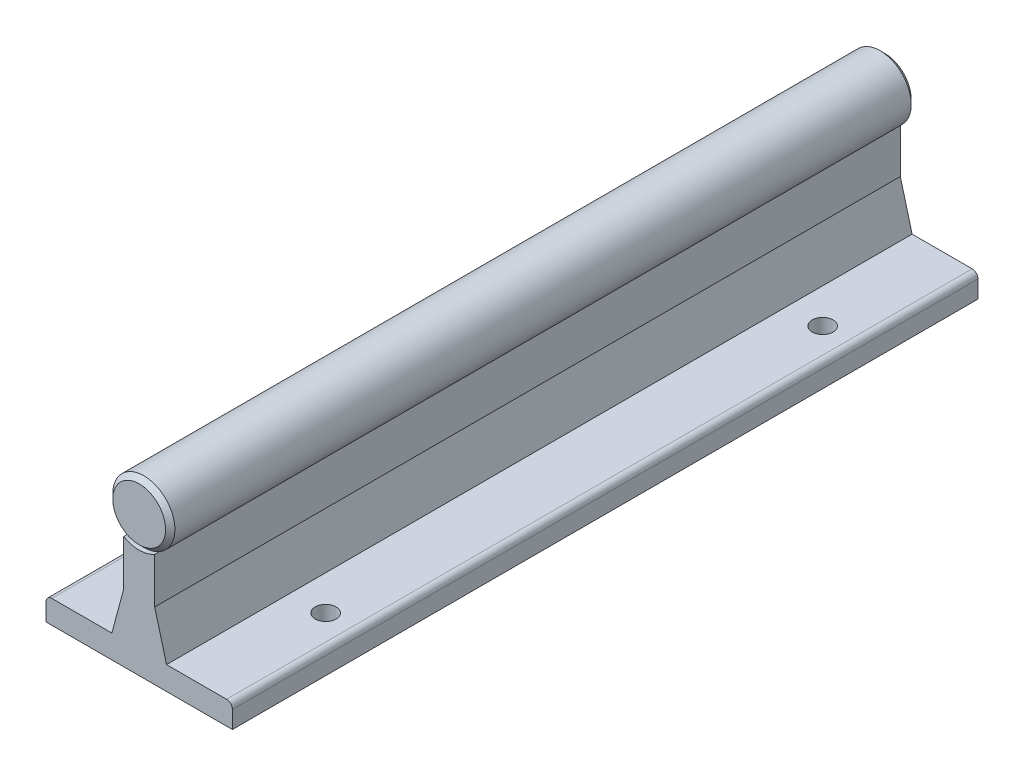
ISO-10303-21;
HEADER;
FILE_DESCRIPTION(('STEP AP214'),'2;1');
FILE_NAME('part.step','',(''),(''),'','','');
FILE_SCHEMA(('AUTOMOTIVE_DESIGN { 1 0 10303 214 1 1 1 1 }'));
ENDSEC;
DATA;
#1=APPLICATION_CONTEXT('core data for automotive mechanical design processes');
#2=APPLICATION_PROTOCOL_DEFINITION('international standard','automotive_design',2000,#1);
#3=PRODUCT_CONTEXT('',#1,'mechanical');
#4=PRODUCT('Part','Part','',(#3));
#5=PRODUCT_RELATED_PRODUCT_CATEGORY('part','',(#4));
#6=PRODUCT_DEFINITION_FORMATION('','',#4);
#7=PRODUCT_DEFINITION_CONTEXT('part definition',#1,'design');
#8=PRODUCT_DEFINITION('design','',#6,#7);
#9=PRODUCT_DEFINITION_SHAPE('','',#8);
#10=(LENGTH_UNIT() NAMED_UNIT(*) SI_UNIT(.MILLI.,.METRE.));
#11=(NAMED_UNIT(*) PLANE_ANGLE_UNIT() SI_UNIT($,.RADIAN.));
#12=(NAMED_UNIT(*) SI_UNIT($,.STERADIAN.) SOLID_ANGLE_UNIT());
#13=UNCERTAINTY_MEASURE_WITH_UNIT(LENGTH_MEASURE(1.E-05),#10,'distance_accuracy_value','');
#14=(GEOMETRIC_REPRESENTATION_CONTEXT(3) GLOBAL_UNCERTAINTY_ASSIGNED_CONTEXT((#13)) GLOBAL_UNIT_ASSIGNED_CONTEXT((#10,
#11,#12)) REPRESENTATION_CONTEXT('',''));
#15=CARTESIAN_POINT('',(0.,0.,0.));
#16=DIRECTION('',(0.,0.,1.));
#17=DIRECTION('',(1.,0.,0.));
#18=AXIS2_PLACEMENT_3D('',#15,#16,#17);
#19=CARTESIAN_POINT('',(-19.05,0.,76.2));
#20=DIRECTION('',(0.,1.,0.));
#21=DIRECTION('',(0.,0.,1.));
#22=AXIS2_PLACEMENT_3D('',#19,#20,#21);
#23=PLANE('',#22);
#24=CARTESIAN_POINT('',(12.7,0.,-50.8));
#25=DIRECTION('',(0.,1.,0.));
#26=DIRECTION('',(0.,0.,1.));
#27=AXIS2_PLACEMENT_3D('',#24,#25,#26);
#28=CIRCLE('',#27,2.1463);
#29=CARTESIAN_POINT('',(12.7,0.,-48.6537));
#30=VERTEX_POINT('',#29);
#31=EDGE_CURVE('E344',#30,#30,#28,.T.);
#32=ORIENTED_EDGE('',*,*,#31,.T.);
#33=EDGE_LOOP('',(#32));
#34=FACE_BOUND('',#33,.T.);
#35=CARTESIAN_POINT('',(12.7,0.,50.8));
#36=DIRECTION('',(0.,1.,0.));
#37=DIRECTION('',(0.,0.,1.));
#38=AXIS2_PLACEMENT_3D('',#35,#36,#37);
#39=CIRCLE('',#38,2.1463);
#40=CARTESIAN_POINT('',(12.7,0.,52.9463));
#41=VERTEX_POINT('',#40);
#42=EDGE_CURVE('E357',#41,#41,#39,.T.);
#43=ORIENTED_EDGE('',*,*,#42,.T.);
#44=EDGE_LOOP('',(#43));
#45=FACE_BOUND('',#44,.T.);
#46=DIRECTION('',(1.,0.,0.));
#47=VECTOR('',#46,1.);
#48=CARTESIAN_POINT('',(-19.05,0.,-76.2));
#49=LINE('',#48,#47);
#50=CARTESIAN_POINT('',(-19.05,0.,-76.2));
#51=VERTEX_POINT('',#50);
#52=CARTESIAN_POINT('',(19.05,0.,-76.2));
#53=VERTEX_POINT('',#52);
#54=EDGE_CURVE('E217',#51,#53,#49,.T.);
#55=ORIENTED_EDGE('',*,*,#54,.T.);
#56=DIRECTION('',(0.,0.,-1.));
#57=VECTOR('',#56,1.);
#58=CARTESIAN_POINT('',(19.05,0.,76.2));
#59=LINE('',#58,#57);
#60=CARTESIAN_POINT('',(19.05,0.,76.2));
#61=VERTEX_POINT('',#60);
#62=EDGE_CURVE('E190',#61,#53,#59,.T.);
#63=ORIENTED_EDGE('',*,*,#62,.F.);
#64=DIRECTION('',(1.,0.,0.));
#65=VECTOR('',#64,1.);
#66=CARTESIAN_POINT('',(-19.05,0.,76.2));
#67=LINE('',#66,#65);
#68=CARTESIAN_POINT('',(-19.05,0.,76.2));
#69=VERTEX_POINT('',#68);
#70=EDGE_CURVE('E372',#69,#61,#67,.T.);
#71=ORIENTED_EDGE('',*,*,#70,.F.);
#72=DIRECTION('',(0.,0.,-1.));
#73=VECTOR('',#72,1.);
#74=CARTESIAN_POINT('',(-19.05,0.,76.2));
#75=LINE('',#74,#73);
#76=EDGE_CURVE('E193',#69,#51,#75,.T.);
#77=ORIENTED_EDGE('',*,*,#76,.T.);
#78=EDGE_LOOP('',(#55,#63,#71,#77));
#79=FACE_BOUND('',#78,.T.);
#80=CARTESIAN_POINT('',(-12.7,0.,50.8));
#81=DIRECTION('',(0.,1.,0.));
#82=DIRECTION('',(0.,0.,1.));
#83=AXIS2_PLACEMENT_3D('',#80,#81,#82);
#84=CIRCLE('',#83,2.1463);
#85=CARTESIAN_POINT('',(-12.7,0.,52.9463));
#86=VERTEX_POINT('',#85);
#87=EDGE_CURVE('E351',#86,#86,#84,.T.);
#88=ORIENTED_EDGE('',*,*,#87,.T.);
#89=EDGE_LOOP('',(#88));
#90=FACE_BOUND('',#89,.T.);
#91=CARTESIAN_POINT('',(-12.7,0.,-50.8));
#92=DIRECTION('',(0.,1.,0.));
#93=DIRECTION('',(0.,0.,1.));
#94=AXIS2_PLACEMENT_3D('',#91,#92,#93);
#95=CIRCLE('',#94,2.1463);
#96=CARTESIAN_POINT('',(-12.7,0.,-48.6537));
#97=VERTEX_POINT('',#96);
#98=EDGE_CURVE('E341',#97,#97,#95,.T.);
#99=ORIENTED_EDGE('',*,*,#98,.T.);
#100=EDGE_LOOP('',(#99));
#101=FACE_BOUND('',#100,.T.);
#102=ADVANCED_FACE('F32',(#34,#45,#79,#90,#101),#23,.F.);
#103=CARTESIAN_POINT('',(-5.58598361192192,4.7625,76.2));
#104=DIRECTION('',(0.,-1.,0.));
#105=DIRECTION('',(1.,0.,0.));
#106=AXIS2_PLACEMENT_3D('',#103,#104,#105);
#107=PLANE('',#106);
#108=CARTESIAN_POINT('',(-12.7,4.7625,50.8));
#109=DIRECTION('',(0.,-1.,0.));
#110=DIRECTION('',(1.,0.,0.));
#111=AXIS2_PLACEMENT_3D('',#108,#109,#110);
#112=CIRCLE('',#111,2.1463);
#113=CARTESIAN_POINT('',(-10.5537,4.7625,50.8));
#114=VERTEX_POINT('',#113);
#115=EDGE_CURVE('E354',#114,#114,#112,.T.);
#116=ORIENTED_EDGE('',*,*,#115,.T.);
#117=EDGE_LOOP('',(#116));
#118=FACE_BOUND('',#117,.T.);
#119=DIRECTION('',(-1.,0.,0.));
#120=VECTOR('',#119,1.);
#121=CARTESIAN_POINT('',(-5.58598361192192,4.7625,-76.2));
#122=LINE('',#121,#120);
#123=CARTESIAN_POINT('',(-5.58598361192192,4.7625,-76.2));
#124=VERTEX_POINT('',#123);
#125=CARTESIAN_POINT('',(-17.859375,4.7625,-76.2));
#126=VERTEX_POINT('',#125);
#127=EDGE_CURVE('E165',#124,#126,#122,.T.);
#128=ORIENTED_EDGE('',*,*,#127,.T.);
#129=DIRECTION('',(0.,0.,-1.));
#130=VECTOR('',#129,1.);
#131=CARTESIAN_POINT('',(-17.859375,4.7625,76.2));
#132=LINE('',#131,#130);
#133=CARTESIAN_POINT('',(-17.859375,4.7625,76.2));
#134=VERTEX_POINT('',#133);
#135=EDGE_CURVE('E11',#126,#134,#132,.F.);
#136=ORIENTED_EDGE('',*,*,#135,.T.);
#137=DIRECTION('',(-1.,0.,0.));
#138=VECTOR('',#137,1.);
#139=CARTESIAN_POINT('',(-5.58598361192192,4.7625,76.2));
#140=LINE('',#139,#138);
#141=CARTESIAN_POINT('',(-5.58598361192192,4.7625,76.2));
#142=VERTEX_POINT('',#141);
#143=EDGE_CURVE('E177',#142,#134,#140,.T.);
#144=ORIENTED_EDGE('',*,*,#143,.F.);
#145=DIRECTION('',(0.,0.,-1.));
#146=VECTOR('',#145,1.);
#147=CARTESIAN_POINT('',(-5.58598361192192,4.7625,76.2));
#148=LINE('',#147,#146);
#149=EDGE_CURVE('E173',#142,#124,#148,.T.);
#150=ORIENTED_EDGE('',*,*,#149,.T.);
#151=EDGE_LOOP('',(#128,#136,#144,#150));
#152=FACE_BOUND('',#151,.T.);
#153=CARTESIAN_POINT('',(-12.7,4.7625,-50.8));
#154=DIRECTION('',(0.,-1.,0.));
#155=DIRECTION('',(1.,0.,0.));
#156=AXIS2_PLACEMENT_3D('',#153,#154,#155);
#157=CIRCLE('',#156,2.1463);
#158=CARTESIAN_POINT('',(-10.5537,4.7625,-50.8));
#159=VERTEX_POINT('',#158);
#160=EDGE_CURVE('E338',#159,#159,#157,.T.);
#161=ORIENTED_EDGE('',*,*,#160,.T.);
#162=EDGE_LOOP('',(#161));
#163=FACE_BOUND('',#162,.T.);
#164=ADVANCED_FACE('F270',(#118,#152,#163),#107,.F.);
#165=CARTESIAN_POINT('',(19.05,4.7625,76.2));
#166=DIRECTION('',(0.,-1.,0.));
#167=DIRECTION('',(1.,0.,0.));
#168=AXIS2_PLACEMENT_3D('',#165,#166,#167);
#169=PLANE('',#168);
#170=CARTESIAN_POINT('',(12.7,4.7625,50.8));
#171=DIRECTION('',(0.,-1.,0.));
#172=DIRECTION('',(1.,0.,0.));
#173=AXIS2_PLACEMENT_3D('',#170,#171,#172);
#174=CIRCLE('',#173,2.1463);
#175=CARTESIAN_POINT('',(14.8463,4.7625,50.8));
#176=VERTEX_POINT('',#175);
#177=EDGE_CURVE('E145',#176,#176,#174,.T.);
#178=ORIENTED_EDGE('',*,*,#177,.T.);
#179=EDGE_LOOP('',(#178));
#180=FACE_BOUND('',#179,.T.);
#181=DIRECTION('',(-1.,0.,0.));
#182=VECTOR('',#181,1.);
#183=CARTESIAN_POINT('',(19.05,4.7625,76.2));
#184=LINE('',#183,#182);
#185=CARTESIAN_POINT('',(17.859375,4.7625,76.2));
#186=VERTEX_POINT('',#185);
#187=CARTESIAN_POINT('',(5.58598361192192,4.7625,76.2));
#188=VERTEX_POINT('',#187);
#189=EDGE_CURVE('E250',#186,#188,#184,.T.);
#190=ORIENTED_EDGE('',*,*,#189,.F.);
#191=DIRECTION('',(0.,0.,-1.));
#192=VECTOR('',#191,1.);
#193=CARTESIAN_POINT('',(17.859375,4.7625,76.2));
#194=LINE('',#193,#192);
#195=CARTESIAN_POINT('',(17.859375,4.7625,-76.2));
#196=VERTEX_POINT('',#195);
#197=EDGE_CURVE('E196',#186,#196,#194,.T.);
#198=ORIENTED_EDGE('',*,*,#197,.T.);
#199=DIRECTION('',(-1.,0.,0.));
#200=VECTOR('',#199,1.);
#201=CARTESIAN_POINT('',(19.05,4.7625,-76.2));
#202=LINE('',#201,#200);
#203=CARTESIAN_POINT('',(5.58598361192192,4.7625,-76.2));
#204=VERTEX_POINT('',#203);
#205=EDGE_CURVE('E230',#196,#204,#202,.T.);
#206=ORIENTED_EDGE('',*,*,#205,.T.);
#207=DIRECTION('',(0.,0.,-1.));
#208=VECTOR('',#207,1.);
#209=CARTESIAN_POINT('',(5.58598361192192,4.7625,76.2));
#210=LINE('',#209,#208);
#211=EDGE_CURVE('E187',#188,#204,#210,.T.);
#212=ORIENTED_EDGE('',*,*,#211,.F.);
#213=EDGE_LOOP('',(#190,#198,#206,#212));
#214=FACE_BOUND('',#213,.T.);
#215=CARTESIAN_POINT('',(12.7,4.7625,-50.8));
#216=DIRECTION('',(0.,-1.,0.));
#217=DIRECTION('',(1.,0.,0.));
#218=AXIS2_PLACEMENT_3D('',#215,#216,#217);
#219=CIRCLE('',#218,2.1463);
#220=CARTESIAN_POINT('',(14.8463,4.7625,-50.8));
#221=VERTEX_POINT('',#220);
#222=EDGE_CURVE('E348',#221,#221,#219,.T.);
#223=ORIENTED_EDGE('',*,*,#222,.T.);
#224=EDGE_LOOP('',(#223));
#225=FACE_BOUND('',#224,.T.);
#226=ADVANCED_FACE('F276',(#180,#214,#225),#169,.F.);
#227=CARTESIAN_POINT('',(0.,28.575,76.2));
#228=DIRECTION('',(0.,0.,-1.));
#229=DIRECTION('',(-1.,0.,0.));
#230=AXIS2_PLACEMENT_3D('',#227,#228,#229);
#231=CYLINDRICAL_SURFACE('',#230,6.35);
#232=CARTESIAN_POINT('',(0.,28.575,-75.2475));
#233=DIRECTION('',(0.,0.,1.));
#234=DIRECTION('',(1.,0.,0.));
#235=AXIS2_PLACEMENT_3D('',#232,#233,#234);
#236=CIRCLE('',#235,6.35);
#237=CARTESIAN_POINT('',(3.175,23.0757386859688,-75.2475));
#238=VERTEX_POINT('',#237);
#239=CARTESIAN_POINT('',(-3.175,23.0757386859688,-75.2475));
#240=VERTEX_POINT('',#239);
#241=EDGE_CURVE('E144',#238,#240,#236,.T.);
#242=ORIENTED_EDGE('',*,*,#241,.T.);
#243=DIRECTION('',(0.,0.,-1.));
#244=VECTOR('',#243,1.);
#245=CARTESIAN_POINT('',(-3.17500000000001,23.0757386859688,76.2));
#246=LINE('',#245,#244);
#247=CARTESIAN_POINT('',(-3.175,23.0757386859688,75.2475));
#248=VERTEX_POINT('',#247);
#249=EDGE_CURVE('E155',#248,#240,#246,.T.);
#250=ORIENTED_EDGE('',*,*,#249,.F.);
#251=CARTESIAN_POINT('',(0.,28.575,75.2475));
#252=DIRECTION('',(0.,0.,1.));
#253=DIRECTION('',(1.,0.,0.));
#254=AXIS2_PLACEMENT_3D('',#251,#252,#253);
#255=CIRCLE('',#254,6.35);
#256=CARTESIAN_POINT('',(3.175,23.0757386859688,75.2475));
#257=VERTEX_POINT('',#256);
#258=EDGE_CURVE('E369',#257,#248,#255,.T.);
#259=ORIENTED_EDGE('',*,*,#258,.F.);
#260=DIRECTION('',(0.,0.,-1.));
#261=VECTOR('',#260,1.);
#262=CARTESIAN_POINT('',(3.175,23.0757386859688,76.2));
#263=LINE('',#262,#261);
#264=EDGE_CURVE('E181',#257,#238,#263,.T.);
#265=ORIENTED_EDGE('',*,*,#264,.T.);
#266=EDGE_LOOP('',(#242,#250,#259,#265));
#267=FACE_BOUND('',#266,.T.);
#268=ADVANCED_FACE('F296',(#267),#231,.T.);
#269=CARTESIAN_POINT('',(0.,28.575,-76.2));
#270=DIRECTION('',(0.,0.,1.));
#271=DIRECTION('',(1.,0.,0.));
#272=AXIS2_PLACEMENT_3D('',#269,#270,#271);
#273=PLANE('',#272);
#274=ORIENTED_EDGE('',*,*,#205,.F.);
#275=CARTESIAN_POINT('',(17.859375,3.571875,-76.2));
#276=DIRECTION('',(0.,0.,1.));
#277=DIRECTION('',(1.,0.,0.));
#278=AXIS2_PLACEMENT_3D('',#275,#276,#277);
#279=CIRCLE('',#278,1.190625);
#280=CARTESIAN_POINT('',(19.05,3.571875,-76.2));
#281=VERTEX_POINT('',#280);
#282=EDGE_CURVE('E201',#196,#281,#279,.F.);
#283=ORIENTED_EDGE('',*,*,#282,.T.);
#284=DIRECTION('',(0.,1.,0.));
#285=VECTOR('',#284,1.);
#286=CARTESIAN_POINT('',(19.05,0.,-76.2));
#287=LINE('',#286,#285);
#288=EDGE_CURVE('E220',#53,#281,#287,.T.);
#289=ORIENTED_EDGE('',*,*,#288,.F.);
#290=ORIENTED_EDGE('',*,*,#54,.F.);
#291=DIRECTION('',(0.,-1.,0.));
#292=VECTOR('',#291,1.);
#293=CARTESIAN_POINT('',(-19.05,4.7625,-76.2));
#294=LINE('',#293,#292);
#295=CARTESIAN_POINT('',(-19.05,3.571875,-76.2));
#296=VERTEX_POINT('',#295);
#297=EDGE_CURVE('E213',#296,#51,#294,.T.);
#298=ORIENTED_EDGE('',*,*,#297,.F.);
#299=CARTESIAN_POINT('',(-17.859375,3.571875,-76.2));
#300=DIRECTION('',(0.,0.,1.));
#301=DIRECTION('',(1.,0.,0.));
#302=AXIS2_PLACEMENT_3D('',#299,#300,#301);
#303=CIRCLE('',#302,1.190625);
#304=EDGE_CURVE('E199',#296,#126,#303,.F.);
#305=ORIENTED_EDGE('',*,*,#304,.T.);
#306=ORIENTED_EDGE('',*,*,#127,.F.);
#307=DIRECTION('',(-0.258819045102521,-0.965925826289068,0.));
#308=VECTOR('',#307,1.);
#309=CARTESIAN_POINT('',(-3.175,13.7604133359085,-76.2));
#310=LINE('',#309,#308);
#311=CARTESIAN_POINT('',(-3.175,13.7604133359085,-76.2));
#312=VERTEX_POINT('',#311);
#313=EDGE_CURVE('E162',#312,#124,#310,.T.);
#314=ORIENTED_EDGE('',*,*,#313,.F.);
#315=DIRECTION('',(0.,-1.,0.));
#316=VECTOR('',#315,1.);
#317=CARTESIAN_POINT('',(-3.175,23.0757386859688,-76.2));
#318=LINE('',#317,#316);
#319=CARTESIAN_POINT('',(-3.175,23.0757386859688,-76.2));
#320=VERTEX_POINT('',#319);
#321=EDGE_CURVE('E151',#320,#312,#318,.T.);
#322=ORIENTED_EDGE('',*,*,#321,.F.);
#323=CARTESIAN_POINT('',(0.,28.575,-76.2));
#324=DIRECTION('',(0.,0.,1.));
#325=DIRECTION('',(1.,0.,0.));
#326=AXIS2_PLACEMENT_3D('',#323,#324,#325);
#327=CIRCLE('',#326,6.35);
#328=CARTESIAN_POINT('',(3.175,23.0757386859688,-76.2));
#329=VERTEX_POINT('',#328);
#330=EDGE_CURVE('E132',#320,#329,#327,.T.);
#331=ORIENTED_EDGE('',*,*,#330,.T.);
#332=DIRECTION('',(0.,1.,0.));
#333=VECTOR('',#332,1.);
#334=CARTESIAN_POINT('',(3.175,23.0757386859688,-76.2));
#335=LINE('',#334,#333);
#336=CARTESIAN_POINT('',(3.175,13.7604133359085,-76.2));
#337=VERTEX_POINT('',#336);
#338=EDGE_CURVE('E163',#337,#329,#335,.T.);
#339=ORIENTED_EDGE('',*,*,#338,.F.);
#340=DIRECTION('',(-0.258819045102521,0.965925826289068,0.));
#341=VECTOR('',#340,1.);
#342=CARTESIAN_POINT('',(3.175,13.7604133359085,-76.2));
#343=LINE('',#342,#341);
#344=EDGE_CURVE('E167',#204,#337,#343,.T.);
#345=ORIENTED_EDGE('',*,*,#344,.F.);
#346=EDGE_LOOP('',(#274,#283,#289,#290,#298,#305,#306,#314,#322,#331,#339,#345));
#347=FACE_BOUND('',#346,.T.);
#348=ADVANCED_FACE('F160',(#347),#273,.F.);
#349=CARTESIAN_POINT('',(0.,28.575,76.2));
#350=DIRECTION('',(0.,0.,1.));
#351=DIRECTION('',(1.,0.,0.));
#352=AXIS2_PLACEMENT_3D('',#349,#350,#351);
#353=PLANE('',#352);
#354=DIRECTION('',(0.,1.,0.));
#355=VECTOR('',#354,1.);
#356=CARTESIAN_POINT('',(19.05,0.,76.2));
#357=LINE('',#356,#355);
#358=CARTESIAN_POINT('',(19.05,3.571875,76.2));
#359=VERTEX_POINT('',#358);
#360=EDGE_CURVE('E374',#61,#359,#357,.T.);
#361=ORIENTED_EDGE('',*,*,#360,.T.);
#362=CARTESIAN_POINT('',(17.859375,3.571875,76.2));
#363=DIRECTION('',(0.,0.,1.));
#364=DIRECTION('',(1.,0.,0.));
#365=AXIS2_PLACEMENT_3D('',#362,#363,#364);
#366=CIRCLE('',#365,1.190625);
#367=EDGE_CURVE('E206',#359,#186,#366,.T.);
#368=ORIENTED_EDGE('',*,*,#367,.T.);
#369=ORIENTED_EDGE('',*,*,#189,.T.);
#370=DIRECTION('',(-0.258819045102521,0.965925826289068,0.));
#371=VECTOR('',#370,1.);
#372=CARTESIAN_POINT('',(3.175,13.7604133359085,76.2));
#373=LINE('',#372,#371);
#374=CARTESIAN_POINT('',(3.175,13.7604133359085,76.2));
#375=VERTEX_POINT('',#374);
#376=EDGE_CURVE('E246',#188,#375,#373,.T.);
#377=ORIENTED_EDGE('',*,*,#376,.T.);
#378=DIRECTION('',(0.,1.,0.));
#379=VECTOR('',#378,1.);
#380=CARTESIAN_POINT('',(3.175,23.0757386859688,76.2));
#381=LINE('',#380,#379);
#382=CARTESIAN_POINT('',(3.175,23.0757386859688,76.2));
#383=VERTEX_POINT('',#382);
#384=EDGE_CURVE('E242',#375,#383,#381,.T.);
#385=ORIENTED_EDGE('',*,*,#384,.T.);
#386=CARTESIAN_POINT('',(0.,28.575,76.2));
#387=DIRECTION('',(0.,0.,1.));
#388=DIRECTION('',(1.,0.,0.));
#389=AXIS2_PLACEMENT_3D('',#386,#387,#388);
#390=CIRCLE('',#389,6.35);
#391=CARTESIAN_POINT('',(-3.17500000000001,23.0757386859688,76.2));
#392=VERTEX_POINT('',#391);
#393=EDGE_CURVE('E367',#392,#383,#390,.T.);
#394=ORIENTED_EDGE('',*,*,#393,.F.);
#395=DIRECTION('',(0.,-1.,0.));
#396=VECTOR('',#395,1.);
#397=CARTESIAN_POINT('',(-3.175,23.0757386859688,76.2));
#398=LINE('',#397,#396);
#399=CARTESIAN_POINT('',(-3.175,13.7604133359085,76.2));
#400=VERTEX_POINT('',#399);
#401=EDGE_CURVE('E245',#392,#400,#398,.T.);
#402=ORIENTED_EDGE('',*,*,#401,.T.);
#403=DIRECTION('',(-0.258819045102521,-0.965925826289068,0.));
#404=VECTOR('',#403,1.);
#405=CARTESIAN_POINT('',(-3.175,13.7604133359085,76.2));
#406=LINE('',#405,#404);
#407=EDGE_CURVE('E248',#400,#142,#406,.T.);
#408=ORIENTED_EDGE('',*,*,#407,.T.);
#409=ORIENTED_EDGE('',*,*,#143,.T.);
#410=CARTESIAN_POINT('',(-17.859375,3.571875,76.2));
#411=DIRECTION('',(0.,0.,1.));
#412=DIRECTION('',(1.,0.,0.));
#413=AXIS2_PLACEMENT_3D('',#410,#411,#412);
#414=CIRCLE('',#413,1.190625);
#415=CARTESIAN_POINT('',(-19.05,3.571875,76.2));
#416=VERTEX_POINT('',#415);
#417=EDGE_CURVE('E47',#134,#416,#414,.T.);
#418=ORIENTED_EDGE('',*,*,#417,.T.);
#419=DIRECTION('',(0.,-1.,0.));
#420=VECTOR('',#419,1.);
#421=CARTESIAN_POINT('',(-19.05,4.7625,76.2));
#422=LINE('',#421,#420);
#423=EDGE_CURVE('E172',#416,#69,#422,.T.);
#424=ORIENTED_EDGE('',*,*,#423,.T.);
#425=ORIENTED_EDGE('',*,*,#70,.T.);
#426=EDGE_LOOP('',(#361,#368,#369,#377,#385,#394,#402,#408,#409,#418,#424,#425));
#427=FACE_BOUND('',#426,.T.);
#428=ADVANCED_FACE('F256',(#427),#353,.T.);
#429=CARTESIAN_POINT('',(-19.05,4.7625,76.2));
#430=DIRECTION('',(1.,0.,0.));
#431=DIRECTION('',(0.,1.,0.));
#432=AXIS2_PLACEMENT_3D('',#429,#430,#431);
#433=PLANE('',#432);
#434=ORIENTED_EDGE('',*,*,#423,.F.);
#435=DIRECTION('',(0.,0.,-1.));
#436=VECTOR('',#435,1.);
#437=CARTESIAN_POINT('',(-19.05,3.571875,76.2));
#438=LINE('',#437,#436);
#439=EDGE_CURVE('E40',#416,#296,#438,.T.);
#440=ORIENTED_EDGE('',*,*,#439,.T.);
#441=ORIENTED_EDGE('',*,*,#297,.T.);
#442=ORIENTED_EDGE('',*,*,#76,.F.);
#443=EDGE_LOOP('',(#434,#440,#441,#442));
#444=FACE_BOUND('',#443,.T.);
#445=ADVANCED_FACE('F211',(#444),#433,.F.);
#446=CARTESIAN_POINT('',(19.05,0.,76.2));
#447=DIRECTION('',(-1.,0.,0.));
#448=DIRECTION('',(0.,-1.,0.));
#449=AXIS2_PLACEMENT_3D('',#446,#447,#448);
#450=PLANE('',#449);
#451=ORIENTED_EDGE('',*,*,#288,.T.);
#452=DIRECTION('',(0.,0.,-1.));
#453=VECTOR('',#452,1.);
#454=CARTESIAN_POINT('',(19.05,3.571875,76.2));
#455=LINE('',#454,#453);
#456=EDGE_CURVE('E203',#281,#359,#455,.F.);
#457=ORIENTED_EDGE('',*,*,#456,.T.);
#458=ORIENTED_EDGE('',*,*,#360,.F.);
#459=ORIENTED_EDGE('',*,*,#62,.T.);
#460=EDGE_LOOP('',(#451,#457,#458,#459));
#461=FACE_BOUND('',#460,.T.);
#462=ADVANCED_FACE('F283',(#461),#450,.F.);
#463=CARTESIAN_POINT('',(3.175,13.7604133359085,76.2));
#464=DIRECTION('',(-0.965925826289068,-0.258819045102521,0.));
#465=DIRECTION('',(0.258819045102521,-0.965925826289068,0.));
#466=AXIS2_PLACEMENT_3D('',#463,#464,#465);
#467=PLANE('',#466);
#468=ORIENTED_EDGE('',*,*,#344,.T.);
#469=DIRECTION('',(0.,0.,-1.));
#470=VECTOR('',#469,1.);
#471=CARTESIAN_POINT('',(3.175,13.7604133359085,76.2));
#472=LINE('',#471,#470);
#473=EDGE_CURVE('E184',#375,#337,#472,.T.);
#474=ORIENTED_EDGE('',*,*,#473,.F.);
#475=ORIENTED_EDGE('',*,*,#376,.F.);
#476=ORIENTED_EDGE('',*,*,#211,.T.);
#477=EDGE_LOOP('',(#468,#474,#475,#476));
#478=FACE_BOUND('',#477,.T.);
#479=ADVANCED_FACE('F234',(#478),#467,.F.);
#480=CARTESIAN_POINT('',(3.175,23.0757386859688,76.2));
#481=DIRECTION('',(-1.,0.,0.));
#482=DIRECTION('',(0.,0.,1.));
#483=AXIS2_PLACEMENT_3D('',#480,#481,#482);
#484=PLANE('',#483);
#485=ORIENTED_EDGE('',*,*,#338,.T.);
#486=DIRECTION('',(0.,0.,-1.));
#487=VECTOR('',#486,1.);
#488=CARTESIAN_POINT('',(3.175,23.0757386859688,-75.2475));
#489=LINE('',#488,#487);
#490=EDGE_CURVE('E139',#238,#329,#489,.T.);
#491=ORIENTED_EDGE('',*,*,#490,.F.);
#492=ORIENTED_EDGE('',*,*,#264,.F.);
#493=EDGE_CURVE('E182',#383,#257,#263,.T.);
#494=ORIENTED_EDGE('',*,*,#493,.F.);
#495=ORIENTED_EDGE('',*,*,#384,.F.);
#496=ORIENTED_EDGE('',*,*,#473,.T.);
#497=EDGE_LOOP('',(#485,#491,#492,#494,#495,#496));
#498=FACE_BOUND('',#497,.T.);
#499=ADVANCED_FACE('F239',(#498),#484,.F.);
#500=CARTESIAN_POINT('',(-3.175,23.0757386859688,76.2));
#501=DIRECTION('',(1.,0.,0.));
#502=DIRECTION('',(0.,0.,-1.));
#503=AXIS2_PLACEMENT_3D('',#500,#501,#502);
#504=PLANE('',#503);
#505=ORIENTED_EDGE('',*,*,#321,.T.);
#506=DIRECTION('',(0.,0.,-1.));
#507=VECTOR('',#506,1.);
#508=CARTESIAN_POINT('',(-3.175,13.7604133359085,76.2));
#509=LINE('',#508,#507);
#510=EDGE_CURVE('E176',#400,#312,#509,.T.);
#511=ORIENTED_EDGE('',*,*,#510,.F.);
#512=ORIENTED_EDGE('',*,*,#401,.F.);
#513=EDGE_CURVE('E179',#392,#248,#246,.T.);
#514=ORIENTED_EDGE('',*,*,#513,.T.);
#515=ORIENTED_EDGE('',*,*,#249,.T.);
#516=DIRECTION('',(0.,0.,-1.));
#517=VECTOR('',#516,1.);
#518=CARTESIAN_POINT('',(-3.175,23.0757386859688,-75.2475));
#519=LINE('',#518,#517);
#520=EDGE_CURVE('E136',#320,#240,#519,.F.);
#521=ORIENTED_EDGE('',*,*,#520,.F.);
#522=EDGE_LOOP('',(#505,#511,#512,#514,#515,#521));
#523=FACE_BOUND('',#522,.T.);
#524=ADVANCED_FACE('F149',(#523),#504,.F.);
#525=CARTESIAN_POINT('',(-3.175,13.7604133359085,76.2));
#526=DIRECTION('',(0.965925826289068,-0.258819045102521,0.));
#527=DIRECTION('',(0.258819045102521,0.965925826289068,0.));
#528=AXIS2_PLACEMENT_3D('',#525,#526,#527);
#529=PLANE('',#528);
#530=ORIENTED_EDGE('',*,*,#313,.T.);
#531=ORIENTED_EDGE('',*,*,#149,.F.);
#532=ORIENTED_EDGE('',*,*,#407,.F.);
#533=ORIENTED_EDGE('',*,*,#510,.T.);
#534=EDGE_LOOP('',(#530,#531,#532,#533));
#535=FACE_BOUND('',#534,.T.);
#536=ADVANCED_FACE('F315',(#535),#529,.F.);
#537=CARTESIAN_POINT('',(0.,28.575,76.2));
#538=DIRECTION('',(0.,0.,1.));
#539=DIRECTION('',(1.,0.,0.));
#540=AXIS2_PLACEMENT_3D('',#537,#538,#539);
#541=CYLINDRICAL_SURFACE('',#540,6.35);
#542=ORIENTED_EDGE('',*,*,#493,.T.);
#543=EDGE_CURVE('E223',#248,#257,#255,.T.);
#544=ORIENTED_EDGE('',*,*,#543,.F.);
#545=ORIENTED_EDGE('',*,*,#513,.F.);
#546=ORIENTED_EDGE('',*,*,#393,.T.);
#547=EDGE_LOOP('',(#542,#544,#545,#546));
#548=FACE_BOUND('',#547,.T.);
#549=ADVANCED_FACE('F308',(#548),#541,.F.);
#550=CARTESIAN_POINT('',(0.,28.575,76.2));
#551=DIRECTION('',(0.,0.,-1.));
#552=DIRECTION('',(-1.,0.,0.));
#553=AXIS2_PLACEMENT_3D('',#550,#551,#552);
#554=CONICAL_SURFACE('',#553,5.39749999999999,0.785398163397448);
#555=ORIENTED_EDGE('',*,*,#543,.T.);
#556=ORIENTED_EDGE('',*,*,#258,.T.);
#557=EDGE_LOOP('',(#555,#556));
#558=FACE_BOUND('',#557,.T.);
#559=CARTESIAN_POINT('',(0.,28.575,76.2));
#560=DIRECTION('',(0.,0.,1.));
#561=DIRECTION('',(1.,0.,0.));
#562=AXIS2_PLACEMENT_3D('',#559,#560,#561);
#563=CIRCLE('',#562,5.39749999999999);
#564=CARTESIAN_POINT('',(5.39749999999999,28.575,76.2));
#565=VERTEX_POINT('',#564);
#566=EDGE_CURVE('E218',#565,#565,#563,.T.);
#567=ORIENTED_EDGE('',*,*,#566,.F.);
#568=EDGE_LOOP('',(#567));
#569=FACE_BOUND('',#568,.T.);
#570=ADVANCED_FACE('F300',(#558,#569),#554,.T.);
#571=ORIENTED_EDGE('',*,*,#566,.T.);
#572=EDGE_LOOP('',(#571));
#573=FACE_BOUND('',#572,.T.);
#574=ADVANCED_FACE('F292',(#573),#353,.T.);
#575=CARTESIAN_POINT('',(0.,28.575,-75.2475));
#576=DIRECTION('',(0.,0.,-1.));
#577=DIRECTION('',(1.,0.,0.));
#578=AXIS2_PLACEMENT_3D('',#575,#576,#577);
#579=CYLINDRICAL_SURFACE('',#578,6.35);
#580=ORIENTED_EDGE('',*,*,#490,.T.);
#581=ORIENTED_EDGE('',*,*,#330,.F.);
#582=ORIENTED_EDGE('',*,*,#520,.T.);
#583=EDGE_CURVE('E362',#240,#238,#236,.T.);
#584=ORIENTED_EDGE('',*,*,#583,.T.);
#585=EDGE_LOOP('',(#580,#581,#582,#584));
#586=FACE_BOUND('',#585,.T.);
#587=ADVANCED_FACE('F134',(#586),#579,.F.);
#588=CARTESIAN_POINT('',(0.,28.575,-76.2));
#589=DIRECTION('',(0.,0.,1.));
#590=DIRECTION('',(-1.,0.,0.));
#591=AXIS2_PLACEMENT_3D('',#588,#589,#590);
#592=CONICAL_SURFACE('',#591,5.39749999999999,0.785398163397448);
#593=ORIENTED_EDGE('',*,*,#583,.F.);
#594=ORIENTED_EDGE('',*,*,#241,.F.);
#595=EDGE_LOOP('',(#593,#594));
#596=FACE_BOUND('',#595,.T.);
#597=CARTESIAN_POINT('',(0.,28.575,-76.2));
#598=DIRECTION('',(0.,0.,1.));
#599=DIRECTION('',(1.,0.,0.));
#600=AXIS2_PLACEMENT_3D('',#597,#598,#599);
#601=CIRCLE('',#600,5.39749999999999);
#602=CARTESIAN_POINT('',(5.39749999999999,28.575,-76.2));
#603=VERTEX_POINT('',#602);
#604=EDGE_CURVE('E156',#603,#603,#601,.T.);
#605=ORIENTED_EDGE('',*,*,#604,.T.);
#606=EDGE_LOOP('',(#605));
#607=FACE_BOUND('',#606,.T.);
#608=ADVANCED_FACE('F306',(#596,#607),#592,.T.);
#609=ORIENTED_EDGE('',*,*,#604,.F.);
#610=EDGE_LOOP('',(#609));
#611=FACE_BOUND('',#610,.T.);
#612=ADVANCED_FACE('F267',(#611),#273,.F.);
#613=CARTESIAN_POINT('',(17.859375,3.571875,76.2));
#614=DIRECTION('',(0.,0.,-1.));
#615=DIRECTION('',(-1.,0.,0.));
#616=AXIS2_PLACEMENT_3D('',#613,#614,#615);
#617=CYLINDRICAL_SURFACE('',#616,1.190625);
#618=ORIENTED_EDGE('',*,*,#367,.F.);
#619=ORIENTED_EDGE('',*,*,#456,.F.);
#620=ORIENTED_EDGE('',*,*,#282,.F.);
#621=ORIENTED_EDGE('',*,*,#197,.F.);
#622=EDGE_LOOP('',(#618,#619,#620,#621));
#623=FACE_BOUND('',#622,.T.);
#624=ADVANCED_FACE('F259',(#623),#617,.T.);
#625=CARTESIAN_POINT('',(-17.859375,3.571875,76.2));
#626=DIRECTION('',(0.,0.,-1.));
#627=DIRECTION('',(-1.,0.,0.));
#628=AXIS2_PLACEMENT_3D('',#625,#626,#627);
#629=CYLINDRICAL_SURFACE('',#628,1.190625);
#630=ORIENTED_EDGE('',*,*,#417,.F.);
#631=ORIENTED_EDGE('',*,*,#135,.F.);
#632=ORIENTED_EDGE('',*,*,#304,.F.);
#633=ORIENTED_EDGE('',*,*,#439,.F.);
#634=EDGE_LOOP('',(#630,#631,#632,#633));
#635=FACE_BOUND('',#634,.T.);
#636=ADVANCED_FACE('F34',(#635),#629,.T.);
#637=CARTESIAN_POINT('',(12.7,10.8331531378427,50.8));
#638=DIRECTION('',(0.,-1.,0.));
#639=DIRECTION('',(0.,0.,-1.));
#640=AXIS2_PLACEMENT_3D('',#637,#638,#639);
#641=CYLINDRICAL_SURFACE('',#640,2.1463);
#642=ORIENTED_EDGE('',*,*,#177,.F.);
#643=EDGE_LOOP('',(#642));
#644=FACE_BOUND('',#643,.T.);
#645=ORIENTED_EDGE('',*,*,#42,.F.);
#646=EDGE_LOOP('',(#645));
#647=FACE_BOUND('',#646,.T.);
#648=ADVANCED_FACE('F258',(#644,#647),#641,.F.);
#649=CARTESIAN_POINT('',(-12.7,10.8331531378427,50.8));
#650=DIRECTION('',(0.,-1.,0.));
#651=DIRECTION('',(0.,0.,-1.));
#652=AXIS2_PLACEMENT_3D('',#649,#650,#651);
#653=CYLINDRICAL_SURFACE('',#652,2.1463);
#654=ORIENTED_EDGE('',*,*,#115,.F.);
#655=EDGE_LOOP('',(#654));
#656=FACE_BOUND('',#655,.T.);
#657=ORIENTED_EDGE('',*,*,#87,.F.);
#658=EDGE_LOOP('',(#657));
#659=FACE_BOUND('',#658,.T.);
#660=ADVANCED_FACE('F264',(#656,#659),#653,.F.);
#661=CARTESIAN_POINT('',(12.7,10.8331531378427,-50.8));
#662=DIRECTION('',(0.,-1.,0.));
#663=DIRECTION('',(0.,0.,-1.));
#664=AXIS2_PLACEMENT_3D('',#661,#662,#663);
#665=CYLINDRICAL_SURFACE('',#664,2.1463);
#666=ORIENTED_EDGE('',*,*,#222,.F.);
#667=EDGE_LOOP('',(#666));
#668=FACE_BOUND('',#667,.T.);
#669=ORIENTED_EDGE('',*,*,#31,.F.);
#670=EDGE_LOOP('',(#669));
#671=FACE_BOUND('',#670,.T.);
#672=ADVANCED_FACE('F325',(#668,#671),#665,.F.);
#673=CARTESIAN_POINT('',(-12.7,10.8331531378427,-50.8));
#674=DIRECTION('',(0.,-1.,0.));
#675=DIRECTION('',(0.,0.,-1.));
#676=AXIS2_PLACEMENT_3D('',#673,#674,#675);
#677=CYLINDRICAL_SURFACE('',#676,2.1463);
#678=ORIENTED_EDGE('',*,*,#160,.F.);
#679=EDGE_LOOP('',(#678));
#680=FACE_BOUND('',#679,.T.);
#681=ORIENTED_EDGE('',*,*,#98,.F.);
#682=EDGE_LOOP('',(#681));
#683=FACE_BOUND('',#682,.T.);
#684=ADVANCED_FACE('F329',(#680,#683),#677,.F.);
#685=CLOSED_SHELL('',(#102,#164,#226,#268,#348,#428,#445,#462,#479,#499,#524,#536,#549,#570,
#574,#587,#608,#612,#624,#636,#648,#660,#672,#684));
#686=MANIFOLD_SOLID_BREP('B2',#685);
#687=ADVANCED_BREP_SHAPE_REPRESENTATION('',(#18,#686),#14);
#688=SHAPE_DEFINITION_REPRESENTATION(#9,#687);
ENDSEC;
END-ISO-10303-21;
